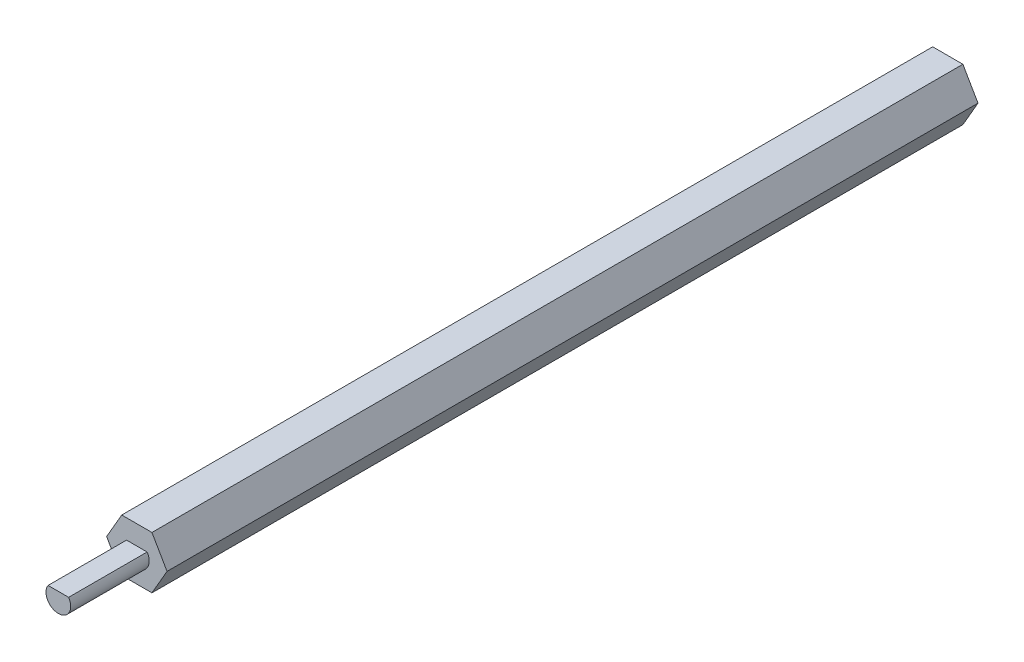
ISO-10303-21;
HEADER;
FILE_DESCRIPTION(('STEP AP214'),'2;1');
FILE_NAME('part.step','',(''),(''),'','','');
FILE_SCHEMA(('AUTOMOTIVE_DESIGN { 1 0 10303 214 1 1 1 1 }'));
ENDSEC;
DATA;
#1=APPLICATION_CONTEXT('core data for automotive mechanical design processes');
#2=APPLICATION_PROTOCOL_DEFINITION('international standard','automotive_design',2000,#1);
#3=PRODUCT_CONTEXT('',#1,'mechanical');
#4=PRODUCT('Part','Part','',(#3));
#5=PRODUCT_RELATED_PRODUCT_CATEGORY('part','',(#4));
#6=PRODUCT_DEFINITION_FORMATION('','',#4);
#7=PRODUCT_DEFINITION_CONTEXT('part definition',#1,'design');
#8=PRODUCT_DEFINITION('design','',#6,#7);
#9=PRODUCT_DEFINITION_SHAPE('','',#8);
#10=(LENGTH_UNIT() NAMED_UNIT(*) SI_UNIT(.MILLI.,.METRE.));
#11=(NAMED_UNIT(*) PLANE_ANGLE_UNIT() SI_UNIT($,.RADIAN.));
#12=(NAMED_UNIT(*) SI_UNIT($,.STERADIAN.) SOLID_ANGLE_UNIT());
#13=UNCERTAINTY_MEASURE_WITH_UNIT(LENGTH_MEASURE(1.E-05),#10,'distance_accuracy_value','');
#14=(GEOMETRIC_REPRESENTATION_CONTEXT(3) GLOBAL_UNCERTAINTY_ASSIGNED_CONTEXT((#13)) GLOBAL_UNIT_ASSIGNED_CONTEXT((#10,
#11,#12)) REPRESENTATION_CONTEXT('',''));
#15=CARTESIAN_POINT('',(0.,0.,0.));
#16=DIRECTION('',(0.,0.,1.));
#17=DIRECTION('',(1.,0.,0.));
#18=AXIS2_PLACEMENT_3D('',#15,#16,#17);
#19=CARTESIAN_POINT('',(7.33234841870825,0.,107.95));
#20=DIRECTION('',(-0.866025403784439,-0.5,0.));
#21=DIRECTION('',(0.5,-0.866025403784439,0.));
#22=AXIS2_PLACEMENT_3D('',#19,#20,#21);
#23=PLANE('',#22);
#24=DIRECTION('',(-0.5,0.866025403784439,0.));
#25=VECTOR('',#24,1.);
#26=CARTESIAN_POINT('',(5.49926131403119,3.175,88.9));
#27=LINE('',#26,#25);
#28=CARTESIAN_POINT('',(7.33234841870825,0.,88.9));
#29=VERTEX_POINT('',#28);
#30=CARTESIAN_POINT('',(3.66617420935413,6.35,88.9));
#31=VERTEX_POINT('',#30);
#32=EDGE_CURVE('E115',#29,#31,#27,.T.);
#33=ORIENTED_EDGE('',*,*,#32,.F.);
#34=DIRECTION('',(0.,0.,-1.));
#35=VECTOR('',#34,1.);
#36=CARTESIAN_POINT('',(7.33234841870825,0.,107.95));
#37=LINE('',#36,#35);
#38=CARTESIAN_POINT('',(7.33234841870825,0.,-107.95));
#39=VERTEX_POINT('',#38);
#40=EDGE_CURVE('E144',#29,#39,#37,.T.);
#41=ORIENTED_EDGE('',*,*,#40,.T.);
#42=DIRECTION('',(-0.5,0.866025403784439,0.));
#43=VECTOR('',#42,1.);
#44=CARTESIAN_POINT('',(7.33234841870825,0.,-107.95));
#45=LINE('',#44,#43);
#46=CARTESIAN_POINT('',(3.66617420935413,6.35,-107.95));
#47=VERTEX_POINT('',#46);
#48=EDGE_CURVE('E125',#39,#47,#45,.T.);
#49=ORIENTED_EDGE('',*,*,#48,.T.);
#50=DIRECTION('',(0.,0.,-1.));
#51=VECTOR('',#50,1.);
#52=CARTESIAN_POINT('',(3.66617420935413,6.35,107.95));
#53=LINE('',#52,#51);
#54=EDGE_CURVE('E11',#31,#47,#53,.T.);
#55=ORIENTED_EDGE('',*,*,#54,.F.);
#56=EDGE_LOOP('',(#33,#41,#49,#55));
#57=FACE_BOUND('',#56,.T.);
#58=ADVANCED_FACE('F32',(#57),#23,.F.);
#59=CARTESIAN_POINT('',(3.66617420935413,6.35,107.95));
#60=DIRECTION('',(0.,-1.,0.));
#61=DIRECTION('',(1.,0.,0.));
#62=AXIS2_PLACEMENT_3D('',#59,#60,#61);
#63=PLANE('',#62);
#64=DIRECTION('',(-1.,0.,0.));
#65=VECTOR('',#64,1.);
#66=CARTESIAN_POINT('',(0.,6.35,88.9));
#67=LINE('',#66,#65);
#68=CARTESIAN_POINT('',(-3.66617420935412,6.35,88.9));
#69=VERTEX_POINT('',#68);
#70=EDGE_CURVE('E117',#31,#69,#67,.T.);
#71=ORIENTED_EDGE('',*,*,#70,.F.);
#72=ORIENTED_EDGE('',*,*,#54,.T.);
#73=DIRECTION('',(-1.,0.,0.));
#74=VECTOR('',#73,1.);
#75=CARTESIAN_POINT('',(3.66617420935413,6.35,-107.95));
#76=LINE('',#75,#74);
#77=CARTESIAN_POINT('',(-3.66617420935412,6.35,-107.95));
#78=VERTEX_POINT('',#77);
#79=EDGE_CURVE('E129',#47,#78,#76,.T.);
#80=ORIENTED_EDGE('',*,*,#79,.T.);
#81=DIRECTION('',(0.,0.,-1.));
#82=VECTOR('',#81,1.);
#83=CARTESIAN_POINT('',(-3.66617420935412,6.35,107.95));
#84=LINE('',#83,#82);
#85=EDGE_CURVE('E39',#69,#78,#84,.T.);
#86=ORIENTED_EDGE('',*,*,#85,.F.);
#87=EDGE_LOOP('',(#71,#72,#80,#86));
#88=FACE_BOUND('',#87,.T.);
#89=ADVANCED_FACE('F161',(#88),#63,.F.);
#90=CARTESIAN_POINT('',(-3.66617420935412,6.35,107.95));
#91=DIRECTION('',(0.866025403784439,-0.5,0.));
#92=DIRECTION('',(0.5,0.866025403784439,0.));
#93=AXIS2_PLACEMENT_3D('',#90,#91,#92);
#94=PLANE('',#93);
#95=DIRECTION('',(-0.5,-0.866025403784439,0.));
#96=VECTOR('',#95,1.);
#97=CARTESIAN_POINT('',(-5.49926131403118,3.175,88.9));
#98=LINE('',#97,#96);
#99=CARTESIAN_POINT('',(-7.33234841870824,0.,88.9));
#100=VERTEX_POINT('',#99);
#101=EDGE_CURVE('E119',#69,#100,#98,.T.);
#102=ORIENTED_EDGE('',*,*,#101,.F.);
#103=ORIENTED_EDGE('',*,*,#85,.T.);
#104=DIRECTION('',(-0.5,-0.866025403784439,0.));
#105=VECTOR('',#104,1.);
#106=CARTESIAN_POINT('',(-3.66617420935412,6.35,-107.95));
#107=LINE('',#106,#105);
#108=CARTESIAN_POINT('',(-7.33234841870824,0.,-107.95));
#109=VERTEX_POINT('',#108);
#110=EDGE_CURVE('E132',#78,#109,#107,.T.);
#111=ORIENTED_EDGE('',*,*,#110,.T.);
#112=DIRECTION('',(0.,0.,-1.));
#113=VECTOR('',#112,1.);
#114=CARTESIAN_POINT('',(-7.33234841870824,0.,107.95));
#115=LINE('',#114,#113);
#116=EDGE_CURVE('E150',#100,#109,#115,.T.);
#117=ORIENTED_EDGE('',*,*,#116,.F.);
#118=EDGE_LOOP('',(#102,#103,#111,#117));
#119=FACE_BOUND('',#118,.T.);
#120=ADVANCED_FACE('F154',(#119),#94,.F.);
#121=CARTESIAN_POINT('',(-7.33234841870824,0.,107.95));
#122=DIRECTION('',(0.866025403784439,0.5,0.));
#123=DIRECTION('',(-0.5,0.866025403784439,0.));
#124=AXIS2_PLACEMENT_3D('',#121,#122,#123);
#125=PLANE('',#124);
#126=DIRECTION('',(0.5,-0.866025403784439,0.));
#127=VECTOR('',#126,1.);
#128=CARTESIAN_POINT('',(-5.49926131403118,-3.175,88.9));
#129=LINE('',#128,#127);
#130=CARTESIAN_POINT('',(-3.66617420935412,-6.35,88.9));
#131=VERTEX_POINT('',#130);
#132=EDGE_CURVE('E121',#100,#131,#129,.T.);
#133=ORIENTED_EDGE('',*,*,#132,.F.);
#134=ORIENTED_EDGE('',*,*,#116,.T.);
#135=DIRECTION('',(0.5,-0.866025403784439,0.));
#136=VECTOR('',#135,1.);
#137=CARTESIAN_POINT('',(-7.33234841870824,0.,-107.95));
#138=LINE('',#137,#136);
#139=CARTESIAN_POINT('',(-3.66617420935412,-6.35,-107.95));
#140=VERTEX_POINT('',#139);
#141=EDGE_CURVE('E135',#109,#140,#138,.T.);
#142=ORIENTED_EDGE('',*,*,#141,.T.);
#143=DIRECTION('',(0.,0.,-1.));
#144=VECTOR('',#143,1.);
#145=CARTESIAN_POINT('',(-3.66617420935412,-6.35,107.95));
#146=LINE('',#145,#144);
#147=EDGE_CURVE('E148',#131,#140,#146,.T.);
#148=ORIENTED_EDGE('',*,*,#147,.F.);
#149=EDGE_LOOP('',(#133,#134,#142,#148));
#150=FACE_BOUND('',#149,.T.);
#151=ADVANCED_FACE('F171',(#150),#125,.F.);
#152=CARTESIAN_POINT('',(-3.66617420935412,-6.35,107.95));
#153=DIRECTION('',(0.,1.,0.));
#154=DIRECTION('',(-1.,0.,0.));
#155=AXIS2_PLACEMENT_3D('',#152,#153,#154);
#156=PLANE('',#155);
#157=DIRECTION('',(1.,0.,0.));
#158=VECTOR('',#157,1.);
#159=CARTESIAN_POINT('',(0.,-6.35,88.9));
#160=LINE('',#159,#158);
#161=CARTESIAN_POINT('',(3.66617420935412,-6.35,88.9));
#162=VERTEX_POINT('',#161);
#163=EDGE_CURVE('E46',#131,#162,#160,.T.);
#164=ORIENTED_EDGE('',*,*,#163,.F.);
#165=ORIENTED_EDGE('',*,*,#147,.T.);
#166=DIRECTION('',(1.,0.,0.));
#167=VECTOR('',#166,1.);
#168=CARTESIAN_POINT('',(-3.66617420935412,-6.35,-107.95));
#169=LINE('',#168,#167);
#170=CARTESIAN_POINT('',(3.66617420935412,-6.35,-107.95));
#171=VERTEX_POINT('',#170);
#172=EDGE_CURVE('E138',#140,#171,#169,.T.);
#173=ORIENTED_EDGE('',*,*,#172,.T.);
#174=DIRECTION('',(0.,0.,-1.));
#175=VECTOR('',#174,1.);
#176=CARTESIAN_POINT('',(3.66617420935412,-6.35,107.95));
#177=LINE('',#176,#175);
#178=EDGE_CURVE('E146',#162,#171,#177,.T.);
#179=ORIENTED_EDGE('',*,*,#178,.F.);
#180=EDGE_LOOP('',(#164,#165,#173,#179));
#181=FACE_BOUND('',#180,.T.);
#182=ADVANCED_FACE('F174',(#181),#156,.F.);
#183=CARTESIAN_POINT('',(3.66617420935412,-6.35,107.95));
#184=DIRECTION('',(-0.866025403784439,0.5,0.));
#185=DIRECTION('',(-0.5,-0.866025403784439,0.));
#186=AXIS2_PLACEMENT_3D('',#183,#184,#185);
#187=PLANE('',#186);
#188=DIRECTION('',(0.5,0.866025403784439,0.));
#189=VECTOR('',#188,1.);
#190=CARTESIAN_POINT('',(5.49926131403119,-3.175,88.9));
#191=LINE('',#190,#189);
#192=EDGE_CURVE('E104',#162,#29,#191,.T.);
#193=ORIENTED_EDGE('',*,*,#192,.F.);
#194=ORIENTED_EDGE('',*,*,#178,.T.);
#195=DIRECTION('',(0.5,0.866025403784439,0.));
#196=VECTOR('',#195,1.);
#197=CARTESIAN_POINT('',(3.66617420935412,-6.35,-107.95));
#198=LINE('',#197,#196);
#199=EDGE_CURVE('E141',#171,#39,#198,.T.);
#200=ORIENTED_EDGE('',*,*,#199,.T.);
#201=ORIENTED_EDGE('',*,*,#40,.F.);
#202=EDGE_LOOP('',(#193,#194,#200,#201));
#203=FACE_BOUND('',#202,.T.);
#204=ADVANCED_FACE('F176',(#203),#187,.F.);
#205=CARTESIAN_POINT('',(0.,0.,-107.95));
#206=DIRECTION('',(0.,0.,1.));
#207=DIRECTION('',(1.,0.,0.));
#208=AXIS2_PLACEMENT_3D('',#205,#206,#207);
#209=PLANE('',#208);
#210=ORIENTED_EDGE('',*,*,#48,.F.);
#211=ORIENTED_EDGE('',*,*,#199,.F.);
#212=ORIENTED_EDGE('',*,*,#172,.F.);
#213=ORIENTED_EDGE('',*,*,#141,.F.);
#214=ORIENTED_EDGE('',*,*,#110,.F.);
#215=ORIENTED_EDGE('',*,*,#79,.F.);
#216=EDGE_LOOP('',(#210,#211,#212,#213,#214,#215));
#217=FACE_BOUND('',#216,.T.);
#218=ADVANCED_FACE('F165',(#217),#209,.F.);
#219=CARTESIAN_POINT('',(0.,1.6583123951777,88.9));
#220=DIRECTION('',(0.,-1.,0.));
#221=DIRECTION('',(0.,0.,-1.));
#222=AXIS2_PLACEMENT_3D('',#219,#220,#221);
#223=PLANE('',#222);
#224=DIRECTION('',(1.,0.,0.));
#225=VECTOR('',#224,1.);
#226=CARTESIAN_POINT('',(0.,1.6583123951777,107.95));
#227=LINE('',#226,#225);
#228=CARTESIAN_POINT('',(-2.5,1.6583123951777,107.95));
#229=VERTEX_POINT('',#228);
#230=CARTESIAN_POINT('',(2.5,1.6583123951777,107.95));
#231=VERTEX_POINT('',#230);
#232=EDGE_CURVE('E54',#229,#231,#227,.T.);
#233=ORIENTED_EDGE('',*,*,#232,.T.);
#234=DIRECTION('',(0.,0.,1.));
#235=VECTOR('',#234,1.);
#236=CARTESIAN_POINT('',(2.5,1.6583123951777,88.9));
#237=LINE('',#236,#235);
#238=CARTESIAN_POINT('',(2.5,1.6583123951777,88.9));
#239=VERTEX_POINT('',#238);
#240=EDGE_CURVE('E98',#239,#231,#237,.T.);
#241=ORIENTED_EDGE('',*,*,#240,.F.);
#242=DIRECTION('',(1.,0.,0.));
#243=VECTOR('',#242,1.);
#244=CARTESIAN_POINT('',(0.,1.6583123951777,88.9));
#245=LINE('',#244,#243);
#246=CARTESIAN_POINT('',(-2.5,1.6583123951777,88.9));
#247=VERTEX_POINT('',#246);
#248=EDGE_CURVE('E105',#247,#239,#245,.T.);
#249=ORIENTED_EDGE('',*,*,#248,.F.);
#250=DIRECTION('',(0.,0.,1.));
#251=VECTOR('',#250,1.);
#252=CARTESIAN_POINT('',(-2.5,1.6583123951777,88.9));
#253=LINE('',#252,#251);
#254=EDGE_CURVE('E100',#247,#229,#253,.T.);
#255=ORIENTED_EDGE('',*,*,#254,.T.);
#256=EDGE_LOOP('',(#233,#241,#249,#255));
#257=FACE_BOUND('',#256,.T.);
#258=ADVANCED_FACE('F107',(#257),#223,.F.);
#259=CARTESIAN_POINT('',(0.,0.,88.9));
#260=DIRECTION('',(0.,0.,1.));
#261=DIRECTION('',(1.,0.,0.));
#262=AXIS2_PLACEMENT_3D('',#259,#260,#261);
#263=CYLINDRICAL_SURFACE('',#262,3.);
#264=CARTESIAN_POINT('',(0.,0.,107.95));
#265=DIRECTION('',(0.,0.,1.));
#266=DIRECTION('',(1.,0.,0.));
#267=AXIS2_PLACEMENT_3D('',#264,#265,#266);
#268=CIRCLE('',#267,3.);
#269=EDGE_CURVE('E110',#229,#231,#268,.T.);
#270=ORIENTED_EDGE('',*,*,#269,.F.);
#271=ORIENTED_EDGE('',*,*,#254,.F.);
#272=CARTESIAN_POINT('',(0.,0.,88.9));
#273=DIRECTION('',(0.,0.,1.));
#274=DIRECTION('',(1.,0.,0.));
#275=AXIS2_PLACEMENT_3D('',#272,#273,#274);
#276=CIRCLE('',#275,3.);
#277=EDGE_CURVE('E95',#247,#239,#276,.T.);
#278=ORIENTED_EDGE('',*,*,#277,.T.);
#279=ORIENTED_EDGE('',*,*,#240,.T.);
#280=EDGE_LOOP('',(#270,#271,#278,#279));
#281=FACE_BOUND('',#280,.T.);
#282=ADVANCED_FACE('F97',(#281),#263,.T.);
#283=CARTESIAN_POINT('',(0.,0.,88.9));
#284=DIRECTION('',(0.,0.,1.));
#285=DIRECTION('',(1.,0.,0.));
#286=AXIS2_PLACEMENT_3D('',#283,#284,#285);
#287=PLANE('',#286);
#288=ORIENTED_EDGE('',*,*,#248,.T.);
#289=ORIENTED_EDGE('',*,*,#277,.F.);
#290=EDGE_LOOP('',(#288,#289));
#291=FACE_BOUND('',#290,.T.);
#292=ORIENTED_EDGE('',*,*,#192,.T.);
#293=ORIENTED_EDGE('',*,*,#32,.T.);
#294=ORIENTED_EDGE('',*,*,#70,.T.);
#295=ORIENTED_EDGE('',*,*,#101,.T.);
#296=ORIENTED_EDGE('',*,*,#132,.T.);
#297=ORIENTED_EDGE('',*,*,#163,.T.);
#298=EDGE_LOOP('',(#292,#293,#294,#295,#296,#297));
#299=FACE_BOUND('',#298,.T.);
#300=ADVANCED_FACE('F109',(#291,#299),#287,.T.);
#301=CARTESIAN_POINT('',(0.,0.,107.95));
#302=DIRECTION('',(0.,0.,1.));
#303=DIRECTION('',(1.,0.,0.));
#304=AXIS2_PLACEMENT_3D('',#301,#302,#303);
#305=PLANE('',#304);
#306=ORIENTED_EDGE('',*,*,#232,.F.);
#307=ORIENTED_EDGE('',*,*,#269,.T.);
#308=EDGE_LOOP('',(#306,#307));
#309=FACE_BOUND('',#308,.T.);
#310=ADVANCED_FACE('F197',(#309),#305,.T.);
#311=CLOSED_SHELL('',(#58,#89,#120,#151,#182,#204,#218,#258,#282,#300,#310));
#312=MANIFOLD_SOLID_BREP('B2',#311);
#313=ADVANCED_BREP_SHAPE_REPRESENTATION('',(#18,#312),#14);
#314=SHAPE_DEFINITION_REPRESENTATION(#9,#313);
ENDSEC;
END-ISO-10303-21;
